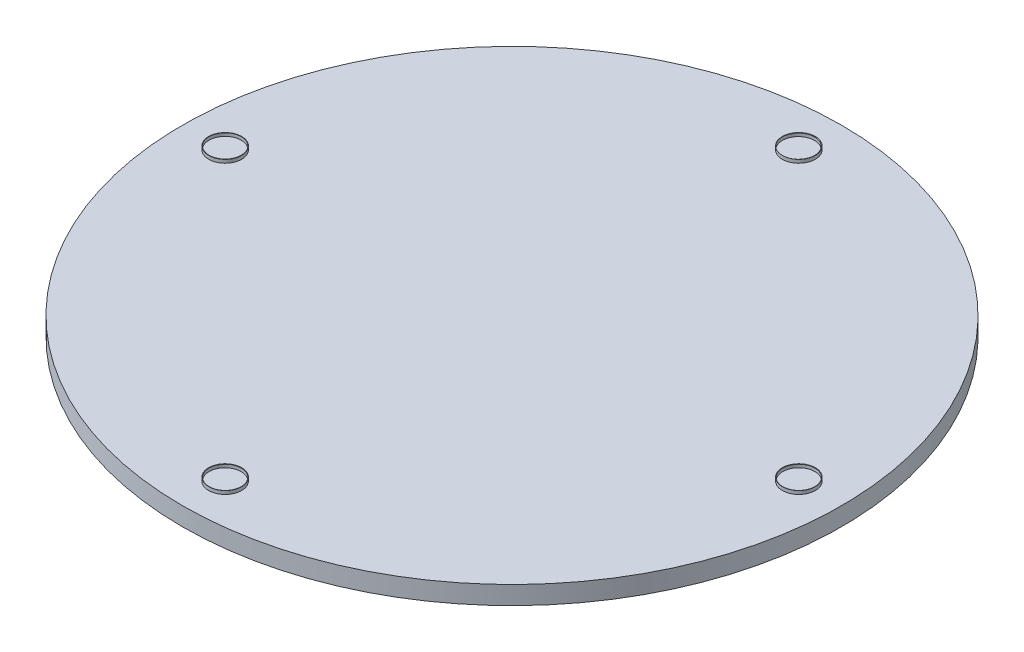
ISO-10303-21;
HEADER;
FILE_DESCRIPTION(('STEP AP214'),'2;1');
FILE_NAME('part.step','',(''),(''),'','','');
FILE_SCHEMA(('AUTOMOTIVE_DESIGN { 1 0 10303 214 1 1 1 1 }'));
ENDSEC;
DATA;
#1=APPLICATION_CONTEXT('core data for automotive mechanical design processes');
#2=APPLICATION_PROTOCOL_DEFINITION('international standard','automotive_design',2000,#1);
#3=PRODUCT_CONTEXT('',#1,'mechanical');
#4=PRODUCT('Part','Part','',(#3));
#5=PRODUCT_RELATED_PRODUCT_CATEGORY('part','',(#4));
#6=PRODUCT_DEFINITION_FORMATION('','',#4);
#7=PRODUCT_DEFINITION_CONTEXT('part definition',#1,'design');
#8=PRODUCT_DEFINITION('design','',#6,#7);
#9=PRODUCT_DEFINITION_SHAPE('','',#8);
#10=(LENGTH_UNIT() NAMED_UNIT(*) SI_UNIT(.MILLI.,.METRE.));
#11=(NAMED_UNIT(*) PLANE_ANGLE_UNIT() SI_UNIT($,.RADIAN.));
#12=(NAMED_UNIT(*) SI_UNIT($,.STERADIAN.) SOLID_ANGLE_UNIT());
#13=UNCERTAINTY_MEASURE_WITH_UNIT(LENGTH_MEASURE(1.E-05),#10,'distance_accuracy_value','');
#14=(GEOMETRIC_REPRESENTATION_CONTEXT(3) GLOBAL_UNCERTAINTY_ASSIGNED_CONTEXT((#13)) GLOBAL_UNIT_ASSIGNED_CONTEXT((#10,
#11,#12)) REPRESENTATION_CONTEXT('',''));
#15=CARTESIAN_POINT('',(0.,0.,0.));
#16=DIRECTION('',(0.,0.,1.));
#17=DIRECTION('',(1.,0.,0.));
#18=AXIS2_PLACEMENT_3D('',#15,#16,#17);
#19=CARTESIAN_POINT('',(0.,30.,0.));
#20=DIRECTION('',(0.,-1.,0.));
#21=DIRECTION('',(0.,0.,-1.));
#22=AXIS2_PLACEMENT_3D('',#19,#20,#21);
#23=CYLINDRICAL_SURFACE('',#22,540.);
#24=CARTESIAN_POINT('',(0.,30.,0.));
#25=DIRECTION('',(0.,1.,0.));
#26=DIRECTION('',(0.,0.,1.));
#27=AXIS2_PLACEMENT_3D('',#24,#25,#26);
#28=CIRCLE('',#27,540.);
#29=CARTESIAN_POINT('',(0.,30.,540.));
#30=VERTEX_POINT('',#29);
#31=EDGE_CURVE('E54',#30,#30,#28,.T.);
#32=ORIENTED_EDGE('',*,*,#31,.F.);
#33=EDGE_LOOP('',(#32));
#34=FACE_BOUND('',#33,.T.);
#35=CARTESIAN_POINT('',(0.,0.,0.));
#36=DIRECTION('',(0.,1.,0.));
#37=DIRECTION('',(0.,0.,1.));
#38=AXIS2_PLACEMENT_3D('',#35,#36,#37);
#39=CIRCLE('',#38,540.);
#40=CARTESIAN_POINT('',(0.,0.,540.));
#41=VERTEX_POINT('',#40);
#42=EDGE_CURVE('E59',#41,#41,#39,.T.);
#43=ORIENTED_EDGE('',*,*,#42,.T.);
#44=EDGE_LOOP('',(#43));
#45=FACE_BOUND('',#44,.T.);
#46=ADVANCED_FACE('F42',(#34,#45),#23,.T.);
#47=CARTESIAN_POINT('',(0.,30.,0.));
#48=DIRECTION('',(0.,1.,0.));
#49=DIRECTION('',(0.,0.,1.));
#50=AXIS2_PLACEMENT_3D('',#47,#48,#49);
#51=PLANE('',#50);
#52=CARTESIAN_POINT('',(0.,30.,470.));
#53=DIRECTION('',(0.,1.,0.));
#54=DIRECTION('',(0.,0.,1.));
#55=AXIS2_PLACEMENT_3D('',#52,#53,#54);
#56=CIRCLE('',#55,27.);
#57=CARTESIAN_POINT('',(0.,30.,497.));
#58=VERTEX_POINT('',#57);
#59=EDGE_CURVE('E10',#58,#58,#56,.T.);
#60=ORIENTED_EDGE('',*,*,#59,.F.);
#61=EDGE_LOOP('',(#60));
#62=FACE_BOUND('',#61,.T.);
#63=CARTESIAN_POINT('',(0.,30.,-470.));
#64=DIRECTION('',(0.,1.,0.));
#65=DIRECTION('',(0.,0.,1.));
#66=AXIS2_PLACEMENT_3D('',#63,#64,#65);
#67=CIRCLE('',#66,27.);
#68=CARTESIAN_POINT('',(0.,30.,-443.));
#69=VERTEX_POINT('',#68);
#70=EDGE_CURVE('E86',#69,#69,#67,.T.);
#71=ORIENTED_EDGE('',*,*,#70,.F.);
#72=EDGE_LOOP('',(#71));
#73=FACE_BOUND('',#72,.T.);
#74=CARTESIAN_POINT('',(470.,30.,0.));
#75=DIRECTION('',(0.,1.,0.));
#76=DIRECTION('',(0.,0.,1.));
#77=AXIS2_PLACEMENT_3D('',#74,#75,#76);
#78=CIRCLE('',#77,27.);
#79=CARTESIAN_POINT('',(470.,30.,27.));
#80=VERTEX_POINT('',#79);
#81=EDGE_CURVE('E49',#80,#80,#78,.T.);
#82=ORIENTED_EDGE('',*,*,#81,.F.);
#83=EDGE_LOOP('',(#82));
#84=FACE_BOUND('',#83,.T.);
#85=CARTESIAN_POINT('',(-470.,30.,0.));
#86=DIRECTION('',(0.,1.,0.));
#87=DIRECTION('',(0.,0.,1.));
#88=AXIS2_PLACEMENT_3D('',#85,#86,#87);
#89=CIRCLE('',#88,27.);
#90=CARTESIAN_POINT('',(-470.,30.,27.));
#91=VERTEX_POINT('',#90);
#92=EDGE_CURVE('E66',#91,#91,#89,.T.);
#93=ORIENTED_EDGE('',*,*,#92,.F.);
#94=EDGE_LOOP('',(#93));
#95=FACE_BOUND('',#94,.T.);
#96=ORIENTED_EDGE('',*,*,#31,.T.);
#97=EDGE_LOOP('',(#96));
#98=FACE_BOUND('',#97,.T.);
#99=ADVANCED_FACE('F150',(#62,#73,#84,#95,#98),#51,.T.);
#100=CARTESIAN_POINT('',(0.,0.,0.));
#101=DIRECTION('',(0.,1.,0.));
#102=DIRECTION('',(0.,0.,1.));
#103=AXIS2_PLACEMENT_3D('',#100,#101,#102);
#104=PLANE('',#103);
#105=ORIENTED_EDGE('',*,*,#42,.F.);
#106=EDGE_LOOP('',(#105));
#107=FACE_BOUND('',#106,.T.);
#108=ADVANCED_FACE('F156',(#107),#104,.F.);
#109=CARTESIAN_POINT('',(-470.,35.5,0.));
#110=DIRECTION('',(0.,-1.,0.));
#111=DIRECTION('',(0.,0.,-1.));
#112=AXIS2_PLACEMENT_3D('',#109,#110,#111);
#113=CYLINDRICAL_SURFACE('',#112,27.);
#114=CARTESIAN_POINT('',(-470.,35.5,0.));
#115=DIRECTION('',(0.,1.,0.));
#116=DIRECTION('',(0.,0.,1.));
#117=AXIS2_PLACEMENT_3D('',#114,#115,#116);
#118=CIRCLE('',#117,27.);
#119=CARTESIAN_POINT('',(-470.,35.5,27.));
#120=VERTEX_POINT('',#119);
#121=EDGE_CURVE('E64',#120,#120,#118,.T.);
#122=ORIENTED_EDGE('',*,*,#121,.F.);
#123=EDGE_LOOP('',(#122));
#124=FACE_BOUND('',#123,.T.);
#125=ORIENTED_EDGE('',*,*,#92,.T.);
#126=EDGE_LOOP('',(#125));
#127=FACE_BOUND('',#126,.T.);
#128=ADVANCED_FACE('F163',(#124,#127),#113,.T.);
#129=CARTESIAN_POINT('',(-470.,35.5,0.));
#130=DIRECTION('',(0.,1.,0.));
#131=DIRECTION('',(0.,0.,1.));
#132=AXIS2_PLACEMENT_3D('',#129,#130,#131);
#133=PLANE('',#132);
#134=CARTESIAN_POINT('',(-470.,35.5,0.));
#135=DIRECTION('',(0.,1.,0.));
#136=DIRECTION('',(0.,0.,1.));
#137=AXIS2_PLACEMENT_3D('',#134,#135,#136);
#138=CIRCLE('',#137,26.3);
#139=CARTESIAN_POINT('',(-470.,35.5,26.3));
#140=VERTEX_POINT('',#139);
#141=EDGE_CURVE('E74',#140,#140,#138,.T.);
#142=ORIENTED_EDGE('',*,*,#141,.F.);
#143=EDGE_LOOP('',(#142));
#144=FACE_BOUND('',#143,.T.);
#145=ORIENTED_EDGE('',*,*,#121,.T.);
#146=EDGE_LOOP('',(#145));
#147=FACE_BOUND('',#146,.T.);
#148=ADVANCED_FACE('F167',(#144,#147),#133,.T.);
#149=CARTESIAN_POINT('',(-470.,30.5,0.));
#150=DIRECTION('',(0.,1.,0.));
#151=DIRECTION('',(0.,0.,1.));
#152=AXIS2_PLACEMENT_3D('',#149,#150,#151);
#153=CYLINDRICAL_SURFACE('',#152,26.3);
#154=CARTESIAN_POINT('',(-470.,30.5,0.));
#155=DIRECTION('',(0.,1.,0.));
#156=DIRECTION('',(0.,0.,1.));
#157=AXIS2_PLACEMENT_3D('',#154,#155,#156);
#158=CIRCLE('',#157,26.3);
#159=CARTESIAN_POINT('',(-470.,30.5,26.3));
#160=VERTEX_POINT('',#159);
#161=EDGE_CURVE('E70',#160,#160,#158,.T.);
#162=ORIENTED_EDGE('',*,*,#161,.F.);
#163=EDGE_LOOP('',(#162));
#164=FACE_BOUND('',#163,.T.);
#165=ORIENTED_EDGE('',*,*,#141,.T.);
#166=EDGE_LOOP('',(#165));
#167=FACE_BOUND('',#166,.T.);
#168=ADVANCED_FACE('F146',(#164,#167),#153,.F.);
#169=CARTESIAN_POINT('',(-470.,30.5,0.));
#170=DIRECTION('',(0.,1.,0.));
#171=DIRECTION('',(0.,0.,1.));
#172=AXIS2_PLACEMENT_3D('',#169,#170,#171);
#173=PLANE('',#172);
#174=ORIENTED_EDGE('',*,*,#161,.T.);
#175=EDGE_LOOP('',(#174));
#176=FACE_BOUND('',#175,.T.);
#177=ADVANCED_FACE('F140',(#176),#173,.T.);
#178=CARTESIAN_POINT('',(470.,35.5,0.));
#179=DIRECTION('',(0.,-1.,0.));
#180=DIRECTION('',(0.,0.,-1.));
#181=AXIS2_PLACEMENT_3D('',#178,#179,#180);
#182=CYLINDRICAL_SURFACE('',#181,27.);
#183=CARTESIAN_POINT('',(470.,35.5,0.));
#184=DIRECTION('',(0.,-1.,0.));
#185=DIRECTION('',(0.,0.,1.));
#186=AXIS2_PLACEMENT_3D('',#183,#184,#185);
#187=CIRCLE('',#186,27.);
#188=CARTESIAN_POINT('',(470.,35.5,27.));
#189=VERTEX_POINT('',#188);
#190=EDGE_CURVE('E78',#189,#189,#187,.T.);
#191=ORIENTED_EDGE('',*,*,#190,.T.);
#192=EDGE_LOOP('',(#191));
#193=FACE_BOUND('',#192,.T.);
#194=ORIENTED_EDGE('',*,*,#81,.T.);
#195=EDGE_LOOP('',(#194));
#196=FACE_BOUND('',#195,.T.);
#197=ADVANCED_FACE('F135',(#193,#196),#182,.T.);
#198=CARTESIAN_POINT('',(470.,35.5,0.));
#199=DIRECTION('',(0.,1.,0.));
#200=DIRECTION('',(0.,0.,1.));
#201=AXIS2_PLACEMENT_3D('',#198,#199,#200);
#202=PLANE('',#201);
#203=CARTESIAN_POINT('',(470.231121869809,35.5,0.273591473096246));
#204=DIRECTION('',(0.,1.,0.));
#205=DIRECTION('',(0.,0.,1.));
#206=AXIS2_PLACEMENT_3D('',#203,#204,#205);
#207=CIRCLE('',#206,26.3);
#208=CARTESIAN_POINT('',(470.231121869809,35.5,26.5735914730962));
#209=VERTEX_POINT('',#208);
#210=EDGE_CURVE('E114',#209,#209,#207,.T.);
#211=ORIENTED_EDGE('',*,*,#210,.F.);
#212=EDGE_LOOP('',(#211));
#213=FACE_BOUND('',#212,.T.);
#214=ORIENTED_EDGE('',*,*,#190,.F.);
#215=EDGE_LOOP('',(#214));
#216=FACE_BOUND('',#215,.T.);
#217=ADVANCED_FACE('F131',(#213,#216),#202,.T.);
#218=CARTESIAN_POINT('',(0.,35.5,-470.));
#219=DIRECTION('',(0.,-1.,0.));
#220=DIRECTION('',(0.,0.,-1.));
#221=AXIS2_PLACEMENT_3D('',#218,#219,#220);
#222=CYLINDRICAL_SURFACE('',#221,27.);
#223=CARTESIAN_POINT('',(0.,35.5,-470.));
#224=DIRECTION('',(0.,1.,0.));
#225=DIRECTION('',(0.,0.,1.));
#226=AXIS2_PLACEMENT_3D('',#223,#224,#225);
#227=CIRCLE('',#226,27.);
#228=CARTESIAN_POINT('',(0.,35.5,-443.));
#229=VERTEX_POINT('',#228);
#230=EDGE_CURVE('E85',#229,#229,#227,.T.);
#231=ORIENTED_EDGE('',*,*,#230,.F.);
#232=EDGE_LOOP('',(#231));
#233=FACE_BOUND('',#232,.T.);
#234=ORIENTED_EDGE('',*,*,#70,.T.);
#235=EDGE_LOOP('',(#234));
#236=FACE_BOUND('',#235,.T.);
#237=ADVANCED_FACE('F134',(#233,#236),#222,.T.);
#238=CARTESIAN_POINT('',(0.,35.5,-470.));
#239=DIRECTION('',(0.,1.,0.));
#240=DIRECTION('',(0.,0.,1.));
#241=AXIS2_PLACEMENT_3D('',#238,#239,#240);
#242=PLANE('',#241);
#243=CARTESIAN_POINT('',(0.,35.5,-469.354248554389));
#244=DIRECTION('',(0.,1.,0.));
#245=DIRECTION('',(0.,0.,1.));
#246=AXIS2_PLACEMENT_3D('',#243,#244,#245);
#247=CIRCLE('',#246,26.3);
#248=CARTESIAN_POINT('',(0.,35.5,-443.054248554389));
#249=VERTEX_POINT('',#248);
#250=EDGE_CURVE('E94',#249,#249,#247,.T.);
#251=ORIENTED_EDGE('',*,*,#250,.F.);
#252=EDGE_LOOP('',(#251));
#253=FACE_BOUND('',#252,.T.);
#254=ORIENTED_EDGE('',*,*,#230,.T.);
#255=EDGE_LOOP('',(#254));
#256=FACE_BOUND('',#255,.T.);
#257=ADVANCED_FACE('F214',(#253,#256),#242,.T.);
#258=CARTESIAN_POINT('',(0.,30.5,-469.354248554389));
#259=DIRECTION('',(0.,1.,0.));
#260=DIRECTION('',(0.,0.,1.));
#261=AXIS2_PLACEMENT_3D('',#258,#259,#260);
#262=CYLINDRICAL_SURFACE('',#261,26.3);
#263=CARTESIAN_POINT('',(0.,30.5,-469.354248554389));
#264=DIRECTION('',(0.,1.,0.));
#265=DIRECTION('',(0.,0.,1.));
#266=AXIS2_PLACEMENT_3D('',#263,#264,#265);
#267=CIRCLE('',#266,26.3);
#268=CARTESIAN_POINT('',(0.,30.5,-443.054248554389));
#269=VERTEX_POINT('',#268);
#270=EDGE_CURVE('E90',#269,#269,#267,.T.);
#271=ORIENTED_EDGE('',*,*,#270,.F.);
#272=EDGE_LOOP('',(#271));
#273=FACE_BOUND('',#272,.T.);
#274=ORIENTED_EDGE('',*,*,#250,.T.);
#275=EDGE_LOOP('',(#274));
#276=FACE_BOUND('',#275,.T.);
#277=ADVANCED_FACE('F224',(#273,#276),#262,.F.);
#278=CARTESIAN_POINT('',(0.,30.5,-469.354248554389));
#279=DIRECTION('',(0.,1.,0.));
#280=DIRECTION('',(0.,0.,1.));
#281=AXIS2_PLACEMENT_3D('',#278,#279,#280);
#282=PLANE('',#281);
#283=ORIENTED_EDGE('',*,*,#270,.T.);
#284=EDGE_LOOP('',(#283));
#285=FACE_BOUND('',#284,.T.);
#286=ADVANCED_FACE('F234',(#285),#282,.T.);
#287=CARTESIAN_POINT('',(0.,35.5,470.));
#288=DIRECTION('',(0.,-1.,0.));
#289=DIRECTION('',(0.,0.,-1.));
#290=AXIS2_PLACEMENT_3D('',#287,#288,#289);
#291=CYLINDRICAL_SURFACE('',#290,27.);
#292=CARTESIAN_POINT('',(0.,35.5,470.));
#293=DIRECTION('',(0.,-1.,0.));
#294=DIRECTION('',(0.,0.,-1.));
#295=AXIS2_PLACEMENT_3D('',#292,#293,#294);
#296=CIRCLE('',#295,27.);
#297=CARTESIAN_POINT('',(0.,35.5,443.));
#298=VERTEX_POINT('',#297);
#299=EDGE_CURVE('E98',#298,#298,#296,.T.);
#300=ORIENTED_EDGE('',*,*,#299,.T.);
#301=EDGE_LOOP('',(#300));
#302=FACE_BOUND('',#301,.T.);
#303=ORIENTED_EDGE('',*,*,#59,.T.);
#304=EDGE_LOOP('',(#303));
#305=FACE_BOUND('',#304,.T.);
#306=ADVANCED_FACE('F244',(#302,#305),#291,.T.);
#307=CARTESIAN_POINT('',(0.,35.5,470.));
#308=DIRECTION('',(0.,1.,0.));
#309=DIRECTION('',(0.,0.,-1.));
#310=AXIS2_PLACEMENT_3D('',#307,#308,#309);
#311=PLANE('',#310);
#312=CARTESIAN_POINT('',(0.23126831591469,35.5,470.275017284013));
#313=DIRECTION('',(0.,1.,0.));
#314=DIRECTION('',(0.,0.,1.));
#315=AXIS2_PLACEMENT_3D('',#312,#313,#314);
#316=CIRCLE('',#315,26.3);
#317=CARTESIAN_POINT('',(0.23126831591469,35.5,496.575017284013));
#318=VERTEX_POINT('',#317);
#319=EDGE_CURVE('E106',#318,#318,#316,.T.);
#320=ORIENTED_EDGE('',*,*,#319,.F.);
#321=EDGE_LOOP('',(#320));
#322=FACE_BOUND('',#321,.T.);
#323=ORIENTED_EDGE('',*,*,#299,.F.);
#324=EDGE_LOOP('',(#323));
#325=FACE_BOUND('',#324,.T.);
#326=ADVANCED_FACE('F254',(#322,#325),#311,.T.);
#327=CARTESIAN_POINT('',(0.23126831591469,30.5,470.275017284013));
#328=DIRECTION('',(0.,1.,0.));
#329=DIRECTION('',(0.,0.,1.));
#330=AXIS2_PLACEMENT_3D('',#327,#328,#329);
#331=CYLINDRICAL_SURFACE('',#330,26.3);
#332=CARTESIAN_POINT('',(0.23126831591469,30.5,470.275017284013));
#333=DIRECTION('',(0.,1.,0.));
#334=DIRECTION('',(0.,0.,1.));
#335=AXIS2_PLACEMENT_3D('',#332,#333,#334);
#336=CIRCLE('',#335,26.3);
#337=CARTESIAN_POINT('',(0.23126831591469,30.5,496.575017284013));
#338=VERTEX_POINT('',#337);
#339=EDGE_CURVE('E105',#338,#338,#336,.T.);
#340=ORIENTED_EDGE('',*,*,#339,.F.);
#341=EDGE_LOOP('',(#340));
#342=FACE_BOUND('',#341,.T.);
#343=ORIENTED_EDGE('',*,*,#319,.T.);
#344=EDGE_LOOP('',(#343));
#345=FACE_BOUND('',#344,.T.);
#346=ADVANCED_FACE('F264',(#342,#345),#331,.F.);
#347=CARTESIAN_POINT('',(0.23126831591469,30.5,470.275017284013));
#348=DIRECTION('',(0.,1.,0.));
#349=DIRECTION('',(0.,0.,1.));
#350=AXIS2_PLACEMENT_3D('',#347,#348,#349);
#351=PLANE('',#350);
#352=ORIENTED_EDGE('',*,*,#339,.T.);
#353=EDGE_LOOP('',(#352));
#354=FACE_BOUND('',#353,.T.);
#355=ADVANCED_FACE('F127',(#354),#351,.T.);
#356=CARTESIAN_POINT('',(470.231121869809,30.5,0.273591473096246));
#357=DIRECTION('',(0.,1.,0.));
#358=DIRECTION('',(0.,0.,1.));
#359=AXIS2_PLACEMENT_3D('',#356,#357,#358);
#360=CYLINDRICAL_SURFACE('',#359,26.3);
#361=CARTESIAN_POINT('',(470.231121869809,30.5,0.273591473096246));
#362=DIRECTION('',(0.,1.,0.));
#363=DIRECTION('',(0.,0.,1.));
#364=AXIS2_PLACEMENT_3D('',#361,#362,#363);
#365=CIRCLE('',#364,26.3);
#366=CARTESIAN_POINT('',(470.231121869809,30.5,26.5735914730962));
#367=VERTEX_POINT('',#366);
#368=EDGE_CURVE('E110',#367,#367,#365,.T.);
#369=ORIENTED_EDGE('',*,*,#368,.F.);
#370=EDGE_LOOP('',(#369));
#371=FACE_BOUND('',#370,.T.);
#372=ORIENTED_EDGE('',*,*,#210,.T.);
#373=EDGE_LOOP('',(#372));
#374=FACE_BOUND('',#373,.T.);
#375=ADVANCED_FACE('F124',(#371,#374),#360,.F.);
#376=CARTESIAN_POINT('',(470.231121869809,30.5,0.273591473096246));
#377=DIRECTION('',(0.,1.,0.));
#378=DIRECTION('',(0.,0.,1.));
#379=AXIS2_PLACEMENT_3D('',#376,#377,#378);
#380=PLANE('',#379);
#381=ORIENTED_EDGE('',*,*,#368,.T.);
#382=EDGE_LOOP('',(#381));
#383=FACE_BOUND('',#382,.T.);
#384=ADVANCED_FACE('F122',(#383),#380,.T.);
#385=CLOSED_SHELL('',(#46,#99,#108,#128,#148,#168,#177,#197,#217,#237,#257,#277,#286,#306,#326,
#346,#355,#375,#384));
#386=MANIFOLD_SOLID_BREP('B2',#385);
#387=ADVANCED_BREP_SHAPE_REPRESENTATION('',(#18,#386),#14);
#388=SHAPE_DEFINITION_REPRESENTATION(#9,#387);
ENDSEC;
END-ISO-10303-21;
